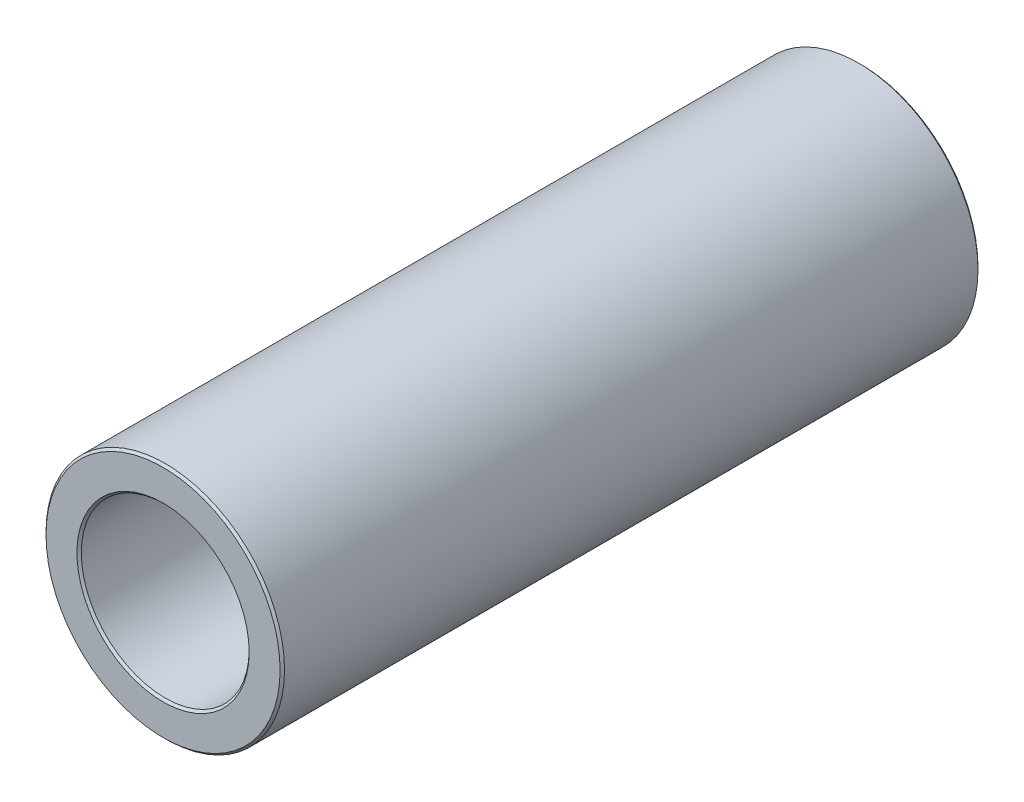
ISO-10303-21;
HEADER;
FILE_DESCRIPTION(('STEP AP214'),'2;1');
FILE_NAME('part.step','',(''),(''),'','','');
FILE_SCHEMA(('AUTOMOTIVE_DESIGN { 1 0 10303 214 1 1 1 1 }'));
ENDSEC;
DATA;
#1=APPLICATION_CONTEXT('core data for automotive mechanical design processes');
#2=APPLICATION_PROTOCOL_DEFINITION('international standard','automotive_design',2000,#1);
#3=PRODUCT_CONTEXT('',#1,'mechanical');
#4=PRODUCT('Part','Part','',(#3));
#5=PRODUCT_RELATED_PRODUCT_CATEGORY('part','',(#4));
#6=PRODUCT_DEFINITION_FORMATION('','',#4);
#7=PRODUCT_DEFINITION_CONTEXT('part definition',#1,'design');
#8=PRODUCT_DEFINITION('design','',#6,#7);
#9=PRODUCT_DEFINITION_SHAPE('','',#8);
#10=(LENGTH_UNIT() NAMED_UNIT(*) SI_UNIT(.MILLI.,.METRE.));
#11=(NAMED_UNIT(*) PLANE_ANGLE_UNIT() SI_UNIT($,.RADIAN.));
#12=(NAMED_UNIT(*) SI_UNIT($,.STERADIAN.) SOLID_ANGLE_UNIT());
#13=UNCERTAINTY_MEASURE_WITH_UNIT(LENGTH_MEASURE(1.E-05),#10,'distance_accuracy_value','');
#14=(GEOMETRIC_REPRESENTATION_CONTEXT(3) GLOBAL_UNCERTAINTY_ASSIGNED_CONTEXT((#13)) GLOBAL_UNIT_ASSIGNED_CONTEXT((#10,
#11,#12)) REPRESENTATION_CONTEXT('',''));
#15=CARTESIAN_POINT('',(0.,0.,0.));
#16=DIRECTION('',(0.,0.,1.));
#17=DIRECTION('',(1.,0.,0.));
#18=AXIS2_PLACEMENT_3D('',#15,#16,#17);
#19=CARTESIAN_POINT('',(0.,0.,79.));
#20=DIRECTION('',(0.,0.,1.));
#21=DIRECTION('',(1.,0.,0.));
#22=AXIS2_PLACEMENT_3D('',#19,#20,#21);
#23=PLANE('',#22);
#24=CARTESIAN_POINT('',(0.,0.,79.));
#25=DIRECTION('',(0.,0.,1.));
#26=DIRECTION('',(1.,0.,0.));
#27=AXIS2_PLACEMENT_3D('',#24,#25,#26);
#28=CIRCLE('',#27,26.5);
#29=CARTESIAN_POINT('',(26.5,0.,79.));
#30=VERTEX_POINT('',#29);
#31=EDGE_CURVE('E59',#30,#30,#28,.T.);
#32=ORIENTED_EDGE('',*,*,#31,.T.);
#33=EDGE_LOOP('',(#32));
#34=FACE_BOUND('',#33,.T.);
#35=CARTESIAN_POINT('',(0.,0.,79.));
#36=DIRECTION('',(0.,0.,1.));
#37=DIRECTION('',(1.,0.,0.));
#38=AXIS2_PLACEMENT_3D('',#35,#36,#37);
#39=CIRCLE('',#38,19.5);
#40=CARTESIAN_POINT('',(19.5,0.,79.));
#41=VERTEX_POINT('',#40);
#42=EDGE_CURVE('E64',#41,#41,#39,.F.);
#43=ORIENTED_EDGE('',*,*,#42,.T.);
#44=EDGE_LOOP('',(#43));
#45=FACE_BOUND('',#44,.T.);
#46=ADVANCED_FACE('F45',(#34,#45),#23,.T.);
#47=CARTESIAN_POINT('',(0.,0.,-79.));
#48=DIRECTION('',(0.,0.,1.));
#49=DIRECTION('',(1.,0.,0.));
#50=AXIS2_PLACEMENT_3D('',#47,#48,#49);
#51=PLANE('',#50);
#52=CARTESIAN_POINT('',(0.,0.,-79.));
#53=DIRECTION('',(0.,0.,1.));
#54=DIRECTION('',(1.,0.,0.));
#55=AXIS2_PLACEMENT_3D('',#52,#53,#54);
#56=CIRCLE('',#55,26.5);
#57=CARTESIAN_POINT('',(26.5,0.,-79.));
#58=VERTEX_POINT('',#57);
#59=EDGE_CURVE('E70',#58,#58,#56,.F.);
#60=ORIENTED_EDGE('',*,*,#59,.T.);
#61=EDGE_LOOP('',(#60));
#62=FACE_BOUND('',#61,.T.);
#63=CARTESIAN_POINT('',(0.,0.,-79.));
#64=DIRECTION('',(0.,0.,1.));
#65=DIRECTION('',(1.,0.,0.));
#66=AXIS2_PLACEMENT_3D('',#63,#64,#65);
#67=CIRCLE('',#66,19.5);
#68=CARTESIAN_POINT('',(19.5,0.,-79.));
#69=VERTEX_POINT('',#68);
#70=EDGE_CURVE('E74',#69,#69,#67,.T.);
#71=ORIENTED_EDGE('',*,*,#70,.T.);
#72=EDGE_LOOP('',(#71));
#73=FACE_BOUND('',#72,.T.);
#74=ADVANCED_FACE('F99',(#62,#73),#51,.F.);
#75=CARTESIAN_POINT('',(0.,0.,79.));
#76=DIRECTION('',(0.,0.,-1.));
#77=DIRECTION('',(-1.,0.,0.));
#78=AXIS2_PLACEMENT_3D('',#75,#76,#77);
#79=CYLINDRICAL_SURFACE('',#78,27.);
#80=CARTESIAN_POINT('',(0.,0.,-78.5));
#81=DIRECTION('',(0.,0.,1.));
#82=DIRECTION('',(1.,0.,0.));
#83=AXIS2_PLACEMENT_3D('',#80,#81,#82);
#84=CIRCLE('',#83,27.);
#85=CARTESIAN_POINT('',(27.,0.,-78.5));
#86=VERTEX_POINT('',#85);
#87=EDGE_CURVE('E78',#86,#86,#84,.T.);
#88=ORIENTED_EDGE('',*,*,#87,.T.);
#89=EDGE_LOOP('',(#88));
#90=FACE_BOUND('',#89,.T.);
#91=CARTESIAN_POINT('',(0.,0.,78.5));
#92=DIRECTION('',(0.,0.,1.));
#93=DIRECTION('',(1.,0.,0.));
#94=AXIS2_PLACEMENT_3D('',#91,#92,#93);
#95=CIRCLE('',#94,27.);
#96=CARTESIAN_POINT('',(27.,0.,78.5));
#97=VERTEX_POINT('',#96);
#98=EDGE_CURVE('E82',#97,#97,#95,.F.);
#99=ORIENTED_EDGE('',*,*,#98,.T.);
#100=EDGE_LOOP('',(#99));
#101=FACE_BOUND('',#100,.T.);
#102=ADVANCED_FACE('F87',(#90,#101),#79,.T.);
#103=CARTESIAN_POINT('',(0.,0.,79.));
#104=DIRECTION('',(0.,0.,-1.));
#105=DIRECTION('',(-1.,0.,0.));
#106=AXIS2_PLACEMENT_3D('',#103,#104,#105);
#107=CYLINDRICAL_SURFACE('',#106,19.);
#108=CARTESIAN_POINT('',(0.,0.,-78.5));
#109=DIRECTION('',(0.,0.,1.));
#110=DIRECTION('',(1.,0.,0.));
#111=AXIS2_PLACEMENT_3D('',#108,#109,#110);
#112=CIRCLE('',#111,19.);
#113=CARTESIAN_POINT('',(19.,0.,-78.5));
#114=VERTEX_POINT('',#113);
#115=EDGE_CURVE('E10',#114,#114,#112,.F.);
#116=ORIENTED_EDGE('',*,*,#115,.T.);
#117=EDGE_LOOP('',(#116));
#118=FACE_BOUND('',#117,.T.);
#119=CARTESIAN_POINT('',(0.,0.,78.5));
#120=DIRECTION('',(0.,0.,1.));
#121=DIRECTION('',(1.,0.,0.));
#122=AXIS2_PLACEMENT_3D('',#119,#120,#121);
#123=CIRCLE('',#122,19.);
#124=CARTESIAN_POINT('',(19.,0.,78.5));
#125=VERTEX_POINT('',#124);
#126=EDGE_CURVE('E54',#125,#125,#123,.T.);
#127=ORIENTED_EDGE('',*,*,#126,.T.);
#128=EDGE_LOOP('',(#127));
#129=FACE_BOUND('',#128,.T.);
#130=ADVANCED_FACE('F124',(#118,#129),#107,.F.);
#131=CARTESIAN_POINT('',(0.,0.,-78.5));
#132=DIRECTION('',(0.,0.,1.));
#133=DIRECTION('',(1.,0.,0.));
#134=AXIS2_PLACEMENT_3D('',#131,#132,#133);
#135=CONICAL_SURFACE('',#134,27.,0.785398163397441);
#136=ORIENTED_EDGE('',*,*,#59,.F.);
#137=EDGE_LOOP('',(#136));
#138=FACE_BOUND('',#137,.T.);
#139=ORIENTED_EDGE('',*,*,#87,.F.);
#140=EDGE_LOOP('',(#139));
#141=FACE_BOUND('',#140,.T.);
#142=ADVANCED_FACE('F93',(#138,#141),#135,.T.);
#143=CARTESIAN_POINT('',(0.,0.,79.));
#144=DIRECTION('',(0.,0.,-1.));
#145=DIRECTION('',(-1.,0.,0.));
#146=AXIS2_PLACEMENT_3D('',#143,#144,#145);
#147=CONICAL_SURFACE('',#146,26.5,0.785398163397469);
#148=ORIENTED_EDGE('',*,*,#98,.F.);
#149=EDGE_LOOP('',(#148));
#150=FACE_BOUND('',#149,.T.);
#151=ORIENTED_EDGE('',*,*,#31,.F.);
#152=EDGE_LOOP('',(#151));
#153=FACE_BOUND('',#152,.T.);
#154=ADVANCED_FACE('F89',(#150,#153),#147,.T.);
#155=CARTESIAN_POINT('',(0.,0.,-79.));
#156=DIRECTION('',(0.,0.,-1.));
#157=DIRECTION('',(-1.,0.,0.));
#158=AXIS2_PLACEMENT_3D('',#155,#156,#157);
#159=CONICAL_SURFACE('',#158,19.5,0.785398163397424);
#160=ORIENTED_EDGE('',*,*,#115,.F.);
#161=EDGE_LOOP('',(#160));
#162=FACE_BOUND('',#161,.T.);
#163=ORIENTED_EDGE('',*,*,#70,.F.);
#164=EDGE_LOOP('',(#163));
#165=FACE_BOUND('',#164,.T.);
#166=ADVANCED_FACE('F92',(#162,#165),#159,.F.);
#167=CARTESIAN_POINT('',(0.,0.,78.5));
#168=DIRECTION('',(0.,0.,1.));
#169=DIRECTION('',(1.,0.,0.));
#170=AXIS2_PLACEMENT_3D('',#167,#168,#169);
#171=CONICAL_SURFACE('',#170,19.,0.78539816339748);
#172=ORIENTED_EDGE('',*,*,#42,.F.);
#173=EDGE_LOOP('',(#172));
#174=FACE_BOUND('',#173,.T.);
#175=ORIENTED_EDGE('',*,*,#126,.F.);
#176=EDGE_LOOP('',(#175));
#177=FACE_BOUND('',#176,.T.);
#178=ADVANCED_FACE('F48',(#174,#177),#171,.F.);
#179=CLOSED_SHELL('',(#46,#74,#102,#130,#142,#154,#166,#178));
#180=MANIFOLD_SOLID_BREP('B2',#179);
#181=ADVANCED_BREP_SHAPE_REPRESENTATION('',(#18,#180),#14);
#182=SHAPE_DEFINITION_REPRESENTATION(#9,#181);
ENDSEC;
END-ISO-10303-21;
